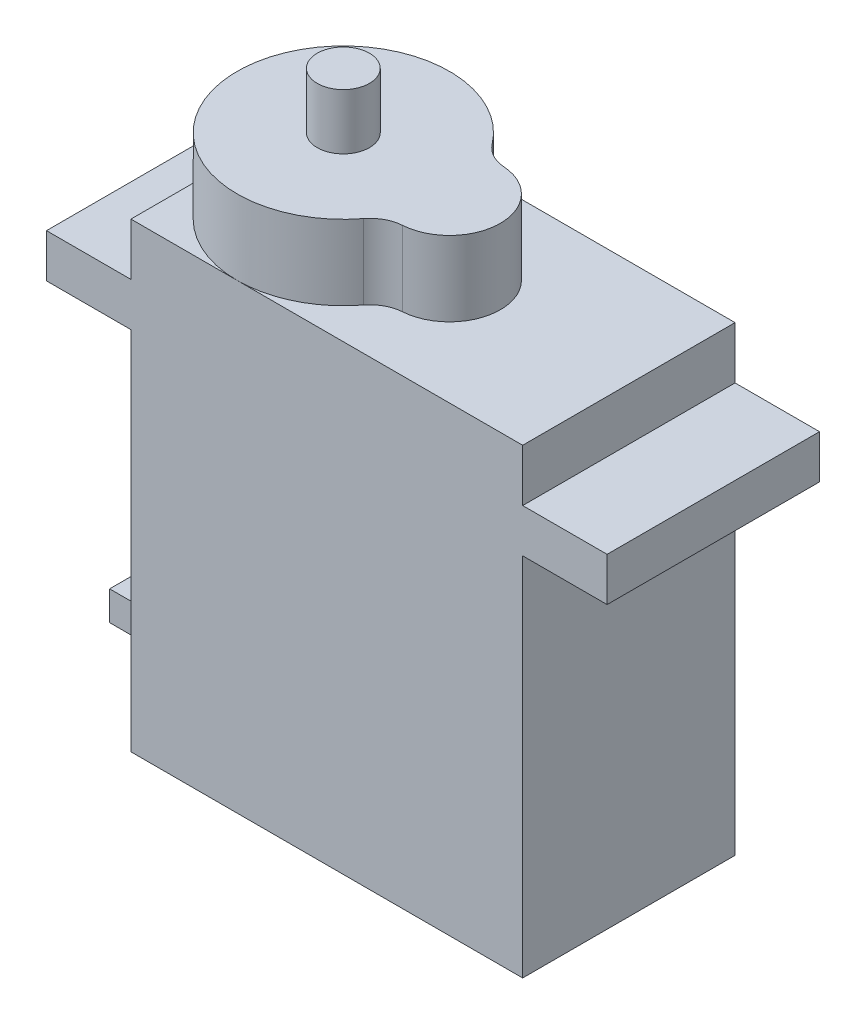
ISO-10303-21;
HEADER;
FILE_DESCRIPTION(('STEP AP214'),'2;1');
FILE_NAME('part.step','',(''),(''),'','','');
FILE_SCHEMA(('AUTOMOTIVE_DESIGN { 1 0 10303 214 1 1 1 1 }'));
ENDSEC;
DATA;
#1=APPLICATION_CONTEXT('core data for automotive mechanical design processes');
#2=APPLICATION_PROTOCOL_DEFINITION('international standard','automotive_design',2000,#1);
#3=PRODUCT_CONTEXT('',#1,'mechanical');
#4=PRODUCT('Part','Part','',(#3));
#5=PRODUCT_RELATED_PRODUCT_CATEGORY('part','',(#4));
#6=PRODUCT_DEFINITION_FORMATION('','',#4);
#7=PRODUCT_DEFINITION_CONTEXT('part definition',#1,'design');
#8=PRODUCT_DEFINITION('design','',#6,#7);
#9=PRODUCT_DEFINITION_SHAPE('','',#8);
#10=(LENGTH_UNIT() NAMED_UNIT(*) SI_UNIT(.MILLI.,.METRE.));
#11=(NAMED_UNIT(*) PLANE_ANGLE_UNIT() SI_UNIT($,.RADIAN.));
#12=(NAMED_UNIT(*) SI_UNIT($,.STERADIAN.) SOLID_ANGLE_UNIT());
#13=UNCERTAINTY_MEASURE_WITH_UNIT(LENGTH_MEASURE(1.E-05),#10,'distance_accuracy_value','');
#14=(GEOMETRIC_REPRESENTATION_CONTEXT(3) GLOBAL_UNCERTAINTY_ASSIGNED_CONTEXT((#13)) GLOBAL_UNIT_ASSIGNED_CONTEXT((#10,
#11,#12)) REPRESENTATION_CONTEXT('',''));
#15=CARTESIAN_POINT('',(0.,0.,0.));
#16=DIRECTION('',(0.,0.,1.));
#17=DIRECTION('',(1.,0.,0.));
#18=AXIS2_PLACEMENT_3D('',#15,#16,#17);
#19=CARTESIAN_POINT('',(-11.25,0.,12.2));
#20=DIRECTION('',(1.,0.,0.));
#21=DIRECTION('',(0.,0.,-1.));
#22=AXIS2_PLACEMENT_3D('',#19,#20,#21);
#23=PLANE('',#22);
#24=DIRECTION('',(0.,-1.,0.));
#25=VECTOR('',#24,1.);
#26=CARTESIAN_POINT('',(-11.25,0.,0.));
#27=LINE('',#26,#25);
#28=CARTESIAN_POINT('',(-11.25,21.,0.));
#29=VERTEX_POINT('',#28);
#30=CARTESIAN_POINT('',(-11.25,0.,0.));
#31=VERTEX_POINT('',#30);
#32=EDGE_CURVE('E302',#29,#31,#27,.T.);
#33=ORIENTED_EDGE('',*,*,#32,.T.);
#34=DIRECTION('',(0.,0.,-1.));
#35=VECTOR('',#34,1.);
#36=CARTESIAN_POINT('',(-11.25,0.,12.2));
#37=LINE('',#36,#35);
#38=CARTESIAN_POINT('',(-11.25,0.,12.2));
#39=VERTEX_POINT('',#38);
#40=EDGE_CURVE('E307',#39,#31,#37,.T.);
#41=ORIENTED_EDGE('',*,*,#40,.F.);
#42=DIRECTION('',(0.,-1.,0.));
#43=VECTOR('',#42,1.);
#44=CARTESIAN_POINT('',(-11.25,0.,12.2));
#45=LINE('',#44,#43);
#46=CARTESIAN_POINT('',(-11.25,21.,12.2));
#47=VERTEX_POINT('',#46);
#48=EDGE_CURVE('E275',#47,#39,#45,.T.);
#49=ORIENTED_EDGE('',*,*,#48,.F.);
#50=DIRECTION('',(0.,0.,-1.));
#51=VECTOR('',#50,1.);
#52=CARTESIAN_POINT('',(-11.25,21.,12.2));
#53=LINE('',#52,#51);
#54=EDGE_CURVE('E310',#47,#29,#53,.T.);
#55=ORIENTED_EDGE('',*,*,#54,.T.);
#56=EDGE_LOOP('',(#33,#41,#49,#55));
#57=FACE_BOUND('',#56,.T.);
#58=DIRECTION('',(0.,1.,0.));
#59=VECTOR('',#58,1.);
#60=CARTESIAN_POINT('',(-11.25,2.03655554591364,8.42287388678305));
#61=LINE('',#60,#59);
#62=CARTESIAN_POINT('',(-11.25,2.03655554591364,8.42287388678305));
#63=VERTEX_POINT('',#62);
#64=CARTESIAN_POINT('',(-11.25,3.71903943259999,8.42287388678305));
#65=VERTEX_POINT('',#64);
#66=EDGE_CURVE('E207',#63,#65,#61,.T.);
#67=ORIENTED_EDGE('',*,*,#66,.F.);
#68=DIRECTION('',(0.,0.,1.));
#69=VECTOR('',#68,1.);
#70=CARTESIAN_POINT('',(-11.25,2.03655554591364,3.77712611321695));
#71=LINE('',#70,#69);
#72=CARTESIAN_POINT('',(-11.25,2.03655554591364,3.77712611321695));
#73=VERTEX_POINT('',#72);
#74=EDGE_CURVE('E204',#73,#63,#71,.T.);
#75=ORIENTED_EDGE('',*,*,#74,.F.);
#76=DIRECTION('',(0.,-1.,0.));
#77=VECTOR('',#76,1.);
#78=CARTESIAN_POINT('',(-11.25,2.03655554591364,3.77712611321695));
#79=LINE('',#78,#77);
#80=CARTESIAN_POINT('',(-11.25,3.71903943259999,3.77712611321695));
#81=VERTEX_POINT('',#80);
#82=EDGE_CURVE('E61',#81,#73,#79,.T.);
#83=ORIENTED_EDGE('',*,*,#82,.F.);
#84=DIRECTION('',(0.,0.,-1.));
#85=VECTOR('',#84,1.);
#86=CARTESIAN_POINT('',(-11.25,3.71903943259999,3.77712611321695));
#87=LINE('',#86,#85);
#88=EDGE_CURVE('E56',#65,#81,#87,.T.);
#89=ORIENTED_EDGE('',*,*,#88,.F.);
#90=EDGE_LOOP('',(#67,#75,#83,#89));
#91=FACE_BOUND('',#90,.T.);
#92=ADVANCED_FACE('F38',(#57,#91),#23,.F.);
#93=CARTESIAN_POINT('',(11.25,26.5,12.2));
#94=DIRECTION('',(0.,-1.,0.));
#95=DIRECTION('',(0.,0.,-1.));
#96=AXIS2_PLACEMENT_3D('',#93,#94,#95);
#97=PLANE('',#96);
#98=CARTESIAN_POINT('',(-5.15,26.5,6.1));
#99=DIRECTION('',(0.,1.,0.));
#100=DIRECTION('',(0.,0.,1.));
#101=AXIS2_PLACEMENT_3D('',#98,#99,#100);
#102=CIRCLE('',#101,6.1);
#103=CARTESIAN_POINT('',(-0.298176494875664,26.5,2.40272956424297));
#104=VERTEX_POINT('',#103);
#105=CARTESIAN_POINT('',(-5.15,26.5,0.));
#106=VERTEX_POINT('',#105);
#107=EDGE_CURVE('E49',#104,#106,#102,.T.);
#108=ORIENTED_EDGE('',*,*,#107,.F.);
#109=CARTESIAN_POINT('',(1.29258531008314,26.5,1.19050974924067));
#110=DIRECTION('',(0.,1.,0.));
#111=DIRECTION('',(0.,0.,1.));
#112=AXIS2_PLACEMENT_3D('',#109,#110,#111);
#113=CIRCLE('',#112,2.);
#114=CARTESIAN_POINT('',(1.15336341348326,26.5,3.1856581806881));
#115=VERTEX_POINT('',#114);
#116=EDGE_CURVE('E218',#104,#115,#113,.T.);
#117=ORIENTED_EDGE('',*,*,#116,.T.);
#118=CARTESIAN_POINT('',(0.949999999999996,26.5,6.1));
#119=DIRECTION('',(0.,1.,0.));
#120=DIRECTION('',(0.,0.,1.));
#121=AXIS2_PLACEMENT_3D('',#118,#119,#120);
#122=CIRCLE('',#121,2.92142857481298);
#123=CARTESIAN_POINT('',(1.15336341348326,26.5,9.0143418193119));
#124=VERTEX_POINT('',#123);
#125=EDGE_CURVE('E231',#124,#115,#122,.T.);
#126=ORIENTED_EDGE('',*,*,#125,.F.);
#127=CARTESIAN_POINT('',(1.29258531008314,26.5,11.0094902507593));
#128=DIRECTION('',(0.,-1.,0.));
#129=DIRECTION('',(0.,0.,-1.));
#130=AXIS2_PLACEMENT_3D('',#127,#128,#129);
#131=CIRCLE('',#130,2.);
#132=CARTESIAN_POINT('',(-0.298176494875664,26.5,9.79727043575703));
#133=VERTEX_POINT('',#132);
#134=EDGE_CURVE('E234',#133,#124,#131,.T.);
#135=ORIENTED_EDGE('',*,*,#134,.F.);
#136=CARTESIAN_POINT('',(-5.15,26.5,12.2));
#137=VERTEX_POINT('',#136);
#138=EDGE_CURVE('E238',#137,#133,#102,.T.);
#139=ORIENTED_EDGE('',*,*,#138,.F.);
#140=DIRECTION('',(-1.,0.,0.));
#141=VECTOR('',#140,1.);
#142=CARTESIAN_POINT('',(11.25,26.5,12.2));
#143=LINE('',#142,#141);
#144=CARTESIAN_POINT('',(11.25,26.5,12.2));
#145=VERTEX_POINT('',#144);
#146=EDGE_CURVE('E264',#145,#137,#143,.T.);
#147=ORIENTED_EDGE('',*,*,#146,.F.);
#148=DIRECTION('',(0.,0.,-1.));
#149=VECTOR('',#148,1.);
#150=CARTESIAN_POINT('',(11.25,26.5,12.2));
#151=LINE('',#150,#149);
#152=CARTESIAN_POINT('',(11.25,26.5,0.));
#153=VERTEX_POINT('',#152);
#154=EDGE_CURVE('E326',#145,#153,#151,.T.);
#155=ORIENTED_EDGE('',*,*,#154,.T.);
#156=DIRECTION('',(-1.,0.,0.));
#157=VECTOR('',#156,1.);
#158=CARTESIAN_POINT('',(11.25,26.5,0.));
#159=LINE('',#158,#157);
#160=EDGE_CURVE('E291',#153,#106,#159,.T.);
#161=ORIENTED_EDGE('',*,*,#160,.T.);
#162=EDGE_LOOP('',(#108,#117,#126,#135,#139,#147,#155,#161));
#163=FACE_BOUND('',#162,.T.);
#164=ADVANCED_FACE('F370',(#163),#97,.F.);
#165=CARTESIAN_POINT('',(-11.25,26.5,6.1));
#166=VERTEX_POINT('',#165);
#167=EDGE_CURVE('E11',#106,#166,#102,.T.);
#168=ORIENTED_EDGE('',*,*,#167,.F.);
#169=CARTESIAN_POINT('',(-11.25,26.5,0.));
#170=VERTEX_POINT('',#169);
#171=EDGE_CURVE('E290',#106,#170,#159,.T.);
#172=ORIENTED_EDGE('',*,*,#171,.T.);
#173=DIRECTION('',(0.,0.,-1.));
#174=VECTOR('',#173,1.);
#175=CARTESIAN_POINT('',(-11.25,26.5,12.2));
#176=LINE('',#175,#174);
#177=EDGE_CURVE('E322',#166,#170,#176,.T.);
#178=ORIENTED_EDGE('',*,*,#177,.F.);
#179=EDGE_LOOP('',(#168,#172,#178));
#180=FACE_BOUND('',#179,.T.);
#181=ADVANCED_FACE('F356',(#180),#97,.F.);
#182=CARTESIAN_POINT('',(11.25,0.,12.2));
#183=DIRECTION('',(-1.,0.,0.));
#184=DIRECTION('',(0.,0.,1.));
#185=AXIS2_PLACEMENT_3D('',#182,#183,#184);
#186=PLANE('',#185);
#187=DIRECTION('',(0.,1.,0.));
#188=VECTOR('',#187,1.);
#189=CARTESIAN_POINT('',(11.25,0.,0.));
#190=LINE('',#189,#188);
#191=CARTESIAN_POINT('',(11.25,0.,0.));
#192=VERTEX_POINT('',#191);
#193=CARTESIAN_POINT('',(11.25,21.,0.));
#194=VERTEX_POINT('',#193);
#195=EDGE_CURVE('E242',#192,#194,#190,.T.);
#196=ORIENTED_EDGE('',*,*,#195,.T.);
#197=DIRECTION('',(0.,0.,-1.));
#198=VECTOR('',#197,1.);
#199=CARTESIAN_POINT('',(11.25,21.,12.2));
#200=LINE('',#199,#198);
#201=CARTESIAN_POINT('',(11.25,21.,12.2));
#202=VERTEX_POINT('',#201);
#203=EDGE_CURVE('E42',#202,#194,#200,.T.);
#204=ORIENTED_EDGE('',*,*,#203,.F.);
#205=DIRECTION('',(0.,1.,0.));
#206=VECTOR('',#205,1.);
#207=CARTESIAN_POINT('',(11.25,0.,12.2));
#208=LINE('',#207,#206);
#209=CARTESIAN_POINT('',(11.25,0.,12.2));
#210=VERTEX_POINT('',#209);
#211=EDGE_CURVE('E251',#210,#202,#208,.T.);
#212=ORIENTED_EDGE('',*,*,#211,.F.);
#213=DIRECTION('',(0.,0.,-1.));
#214=VECTOR('',#213,1.);
#215=CARTESIAN_POINT('',(11.25,0.,12.2));
#216=LINE('',#215,#214);
#217=EDGE_CURVE('E279',#210,#192,#216,.T.);
#218=ORIENTED_EDGE('',*,*,#217,.T.);
#219=EDGE_LOOP('',(#196,#204,#212,#218));
#220=FACE_BOUND('',#219,.T.);
#221=ADVANCED_FACE('F40',(#220),#186,.F.);
#222=CARTESIAN_POINT('',(11.25,21.,12.2));
#223=DIRECTION('',(0.,1.,0.));
#224=DIRECTION('',(-1.,0.,0.));
#225=AXIS2_PLACEMENT_3D('',#222,#223,#224);
#226=PLANE('',#225);
#227=DIRECTION('',(1.,0.,0.));
#228=VECTOR('',#227,1.);
#229=CARTESIAN_POINT('',(11.25,21.,0.));
#230=LINE('',#229,#228);
#231=CARTESIAN_POINT('',(16.1,21.,0.));
#232=VERTEX_POINT('',#231);
#233=EDGE_CURVE('E282',#194,#232,#230,.T.);
#234=ORIENTED_EDGE('',*,*,#233,.T.);
#235=DIRECTION('',(0.,0.,-1.));
#236=VECTOR('',#235,1.);
#237=CARTESIAN_POINT('',(16.1,21.,12.2));
#238=LINE('',#237,#236);
#239=CARTESIAN_POINT('',(16.1,21.,12.2));
#240=VERTEX_POINT('',#239);
#241=EDGE_CURVE('E334',#240,#232,#238,.T.);
#242=ORIENTED_EDGE('',*,*,#241,.F.);
#243=DIRECTION('',(1.,0.,0.));
#244=VECTOR('',#243,1.);
#245=CARTESIAN_POINT('',(11.25,21.,12.2));
#246=LINE('',#245,#244);
#247=EDGE_CURVE('E254',#202,#240,#246,.T.);
#248=ORIENTED_EDGE('',*,*,#247,.F.);
#249=ORIENTED_EDGE('',*,*,#203,.T.);
#250=EDGE_LOOP('',(#234,#242,#248,#249));
#251=FACE_BOUND('',#250,.T.);
#252=ADVANCED_FACE('F416',(#251),#226,.F.);
#253=CARTESIAN_POINT('',(16.1,21.,12.2));
#254=DIRECTION('',(-1.,0.,0.));
#255=DIRECTION('',(0.,0.,1.));
#256=AXIS2_PLACEMENT_3D('',#253,#254,#255);
#257=PLANE('',#256);
#258=DIRECTION('',(0.,1.,0.));
#259=VECTOR('',#258,1.);
#260=CARTESIAN_POINT('',(16.1,21.,0.));
#261=LINE('',#260,#259);
#262=CARTESIAN_POINT('',(16.1,23.5,0.));
#263=VERTEX_POINT('',#262);
#264=EDGE_CURVE('E284',#232,#263,#261,.T.);
#265=ORIENTED_EDGE('',*,*,#264,.T.);
#266=DIRECTION('',(0.,0.,-1.));
#267=VECTOR('',#266,1.);
#268=CARTESIAN_POINT('',(16.1,23.5,12.2));
#269=LINE('',#268,#267);
#270=CARTESIAN_POINT('',(16.1,23.5,12.2));
#271=VERTEX_POINT('',#270);
#272=EDGE_CURVE('E332',#271,#263,#269,.T.);
#273=ORIENTED_EDGE('',*,*,#272,.F.);
#274=DIRECTION('',(0.,1.,0.));
#275=VECTOR('',#274,1.);
#276=CARTESIAN_POINT('',(16.1,21.,12.2));
#277=LINE('',#276,#275);
#278=EDGE_CURVE('E257',#240,#271,#277,.T.);
#279=ORIENTED_EDGE('',*,*,#278,.F.);
#280=ORIENTED_EDGE('',*,*,#241,.T.);
#281=EDGE_LOOP('',(#265,#273,#279,#280));
#282=FACE_BOUND('',#281,.T.);
#283=ADVANCED_FACE('F418',(#282),#257,.F.);
#284=CARTESIAN_POINT('',(16.1,23.5,12.2));
#285=DIRECTION('',(0.,-1.,0.));
#286=DIRECTION('',(0.,0.,-1.));
#287=AXIS2_PLACEMENT_3D('',#284,#285,#286);
#288=PLANE('',#287);
#289=DIRECTION('',(-1.,0.,0.));
#290=VECTOR('',#289,1.);
#291=CARTESIAN_POINT('',(16.1,23.5,0.));
#292=LINE('',#291,#290);
#293=CARTESIAN_POINT('',(11.25,23.5,0.));
#294=VERTEX_POINT('',#293);
#295=EDGE_CURVE('E286',#263,#294,#292,.T.);
#296=ORIENTED_EDGE('',*,*,#295,.T.);
#297=DIRECTION('',(0.,0.,-1.));
#298=VECTOR('',#297,1.);
#299=CARTESIAN_POINT('',(11.25,23.5,12.2));
#300=LINE('',#299,#298);
#301=CARTESIAN_POINT('',(11.25,23.5,12.2));
#302=VERTEX_POINT('',#301);
#303=EDGE_CURVE('E329',#302,#294,#300,.T.);
#304=ORIENTED_EDGE('',*,*,#303,.F.);
#305=DIRECTION('',(-1.,0.,0.));
#306=VECTOR('',#305,1.);
#307=CARTESIAN_POINT('',(16.1,23.5,12.2));
#308=LINE('',#307,#306);
#309=EDGE_CURVE('E259',#271,#302,#308,.T.);
#310=ORIENTED_EDGE('',*,*,#309,.F.);
#311=ORIENTED_EDGE('',*,*,#272,.T.);
#312=EDGE_LOOP('',(#296,#304,#310,#311));
#313=FACE_BOUND('',#312,.T.);
#314=ADVANCED_FACE('F422',(#313),#288,.F.);
#315=CARTESIAN_POINT('',(11.25,23.5,12.2));
#316=DIRECTION('',(-1.,0.,0.));
#317=DIRECTION('',(0.,-1.,0.));
#318=AXIS2_PLACEMENT_3D('',#315,#316,#317);
#319=PLANE('',#318);
#320=DIRECTION('',(0.,1.,0.));
#321=VECTOR('',#320,1.);
#322=CARTESIAN_POINT('',(11.25,23.5,0.));
#323=LINE('',#322,#321);
#324=EDGE_CURVE('E288',#294,#153,#323,.T.);
#325=ORIENTED_EDGE('',*,*,#324,.T.);
#326=ORIENTED_EDGE('',*,*,#154,.F.);
#327=DIRECTION('',(0.,1.,0.));
#328=VECTOR('',#327,1.);
#329=CARTESIAN_POINT('',(11.25,23.5,12.2));
#330=LINE('',#329,#328);
#331=EDGE_CURVE('E261',#302,#145,#330,.T.);
#332=ORIENTED_EDGE('',*,*,#331,.F.);
#333=ORIENTED_EDGE('',*,*,#303,.T.);
#334=EDGE_LOOP('',(#325,#326,#332,#333));
#335=FACE_BOUND('',#334,.T.);
#336=ADVANCED_FACE('F424',(#335),#319,.F.);
#337=EDGE_CURVE('E47',#166,#137,#102,.T.);
#338=ORIENTED_EDGE('',*,*,#337,.F.);
#339=CARTESIAN_POINT('',(-11.25,26.5,12.2));
#340=VERTEX_POINT('',#339);
#341=EDGE_CURVE('E323',#340,#166,#176,.T.);
#342=ORIENTED_EDGE('',*,*,#341,.F.);
#343=EDGE_CURVE('E263',#137,#340,#143,.T.);
#344=ORIENTED_EDGE('',*,*,#343,.F.);
#345=EDGE_LOOP('',(#338,#342,#344));
#346=FACE_BOUND('',#345,.T.);
#347=ADVANCED_FACE('F352',(#346),#97,.F.);
#348=CARTESIAN_POINT('',(-11.25,23.5,12.2));
#349=DIRECTION('',(1.,0.,0.));
#350=DIRECTION('',(0.,1.,0.));
#351=AXIS2_PLACEMENT_3D('',#348,#349,#350);
#352=PLANE('',#351);
#353=DIRECTION('',(0.,-1.,0.));
#354=VECTOR('',#353,1.);
#355=CARTESIAN_POINT('',(-11.25,23.5,0.));
#356=LINE('',#355,#354);
#357=CARTESIAN_POINT('',(-11.25,23.5,0.));
#358=VERTEX_POINT('',#357);
#359=EDGE_CURVE('E294',#170,#358,#356,.T.);
#360=ORIENTED_EDGE('',*,*,#359,.T.);
#361=DIRECTION('',(0.,0.,-1.));
#362=VECTOR('',#361,1.);
#363=CARTESIAN_POINT('',(-11.25,23.5,12.2));
#364=LINE('',#363,#362);
#365=CARTESIAN_POINT('',(-11.25,23.5,12.2));
#366=VERTEX_POINT('',#365);
#367=EDGE_CURVE('E319',#366,#358,#364,.T.);
#368=ORIENTED_EDGE('',*,*,#367,.F.);
#369=DIRECTION('',(0.,-1.,0.));
#370=VECTOR('',#369,1.);
#371=CARTESIAN_POINT('',(-11.25,23.5,12.2));
#372=LINE('',#371,#370);
#373=EDGE_CURVE('E267',#340,#366,#372,.T.);
#374=ORIENTED_EDGE('',*,*,#373,.F.);
#375=ORIENTED_EDGE('',*,*,#341,.T.);
#376=ORIENTED_EDGE('',*,*,#177,.T.);
#377=EDGE_LOOP('',(#360,#368,#374,#375,#376));
#378=FACE_BOUND('',#377,.T.);
#379=ADVANCED_FACE('F360',(#378),#352,.F.);
#380=CARTESIAN_POINT('',(-16.1,23.5,12.2));
#381=DIRECTION('',(0.,-1.,0.));
#382=DIRECTION('',(0.,0.,-1.));
#383=AXIS2_PLACEMENT_3D('',#380,#381,#382);
#384=PLANE('',#383);
#385=DIRECTION('',(-1.,0.,0.));
#386=VECTOR('',#385,1.);
#387=CARTESIAN_POINT('',(-16.1,23.5,0.));
#388=LINE('',#387,#386);
#389=CARTESIAN_POINT('',(-16.1,23.5,0.));
#390=VERTEX_POINT('',#389);
#391=EDGE_CURVE('E296',#358,#390,#388,.T.);
#392=ORIENTED_EDGE('',*,*,#391,.T.);
#393=DIRECTION('',(0.,0.,-1.));
#394=VECTOR('',#393,1.);
#395=CARTESIAN_POINT('',(-16.1,23.5,12.2));
#396=LINE('',#395,#394);
#397=CARTESIAN_POINT('',(-16.1,23.5,12.2));
#398=VERTEX_POINT('',#397);
#399=EDGE_CURVE('E316',#398,#390,#396,.T.);
#400=ORIENTED_EDGE('',*,*,#399,.F.);
#401=DIRECTION('',(-1.,0.,0.));
#402=VECTOR('',#401,1.);
#403=CARTESIAN_POINT('',(-16.1,23.5,12.2));
#404=LINE('',#403,#402);
#405=EDGE_CURVE('E269',#366,#398,#404,.T.);
#406=ORIENTED_EDGE('',*,*,#405,.F.);
#407=ORIENTED_EDGE('',*,*,#367,.T.);
#408=EDGE_LOOP('',(#392,#400,#406,#407));
#409=FACE_BOUND('',#408,.T.);
#410=ADVANCED_FACE('F395',(#409),#384,.F.);
#411=CARTESIAN_POINT('',(-16.1,21.,12.2));
#412=DIRECTION('',(1.,0.,0.));
#413=DIRECTION('',(0.,0.,-1.));
#414=AXIS2_PLACEMENT_3D('',#411,#412,#413);
#415=PLANE('',#414);
#416=DIRECTION('',(0.,-1.,0.));
#417=VECTOR('',#416,1.);
#418=CARTESIAN_POINT('',(-16.1,21.,0.));
#419=LINE('',#418,#417);
#420=CARTESIAN_POINT('',(-16.1,21.,0.));
#421=VERTEX_POINT('',#420);
#422=EDGE_CURVE('E298',#390,#421,#419,.T.);
#423=ORIENTED_EDGE('',*,*,#422,.T.);
#424=DIRECTION('',(0.,0.,-1.));
#425=VECTOR('',#424,1.);
#426=CARTESIAN_POINT('',(-16.1,21.,12.2));
#427=LINE('',#426,#425);
#428=CARTESIAN_POINT('',(-16.1,21.,12.2));
#429=VERTEX_POINT('',#428);
#430=EDGE_CURVE('E313',#429,#421,#427,.T.);
#431=ORIENTED_EDGE('',*,*,#430,.F.);
#432=DIRECTION('',(0.,-1.,0.));
#433=VECTOR('',#432,1.);
#434=CARTESIAN_POINT('',(-16.1,21.,12.2));
#435=LINE('',#434,#433);
#436=EDGE_CURVE('E271',#398,#429,#435,.T.);
#437=ORIENTED_EDGE('',*,*,#436,.F.);
#438=ORIENTED_EDGE('',*,*,#399,.T.);
#439=EDGE_LOOP('',(#423,#431,#437,#438));
#440=FACE_BOUND('',#439,.T.);
#441=ADVANCED_FACE('F399',(#440),#415,.F.);
#442=CARTESIAN_POINT('',(-11.25,21.,12.2));
#443=DIRECTION('',(0.,1.,0.));
#444=DIRECTION('',(0.,0.,1.));
#445=AXIS2_PLACEMENT_3D('',#442,#443,#444);
#446=PLANE('',#445);
#447=DIRECTION('',(1.,0.,0.));
#448=VECTOR('',#447,1.);
#449=CARTESIAN_POINT('',(-11.25,21.,0.));
#450=LINE('',#449,#448);
#451=EDGE_CURVE('E300',#421,#29,#450,.T.);
#452=ORIENTED_EDGE('',*,*,#451,.T.);
#453=ORIENTED_EDGE('',*,*,#54,.F.);
#454=DIRECTION('',(1.,0.,0.));
#455=VECTOR('',#454,1.);
#456=CARTESIAN_POINT('',(-11.25,21.,12.2));
#457=LINE('',#456,#455);
#458=EDGE_CURVE('E273',#429,#47,#457,.T.);
#459=ORIENTED_EDGE('',*,*,#458,.F.);
#460=ORIENTED_EDGE('',*,*,#430,.T.);
#461=EDGE_LOOP('',(#452,#453,#459,#460));
#462=FACE_BOUND('',#461,.T.);
#463=ADVANCED_FACE('F405',(#462),#446,.F.);
#464=CARTESIAN_POINT('',(-11.25,0.,12.2));
#465=DIRECTION('',(0.,1.,0.));
#466=DIRECTION('',(0.,0.,1.));
#467=AXIS2_PLACEMENT_3D('',#464,#465,#466);
#468=PLANE('',#467);
#469=DIRECTION('',(1.,0.,0.));
#470=VECTOR('',#469,1.);
#471=CARTESIAN_POINT('',(-11.25,0.,0.));
#472=LINE('',#471,#470);
#473=EDGE_CURVE('E255',#31,#192,#472,.T.);
#474=ORIENTED_EDGE('',*,*,#473,.T.);
#475=ORIENTED_EDGE('',*,*,#217,.F.);
#476=DIRECTION('',(1.,0.,0.));
#477=VECTOR('',#476,1.);
#478=CARTESIAN_POINT('',(-11.25,0.,12.2));
#479=LINE('',#478,#477);
#480=EDGE_CURVE('E277',#39,#210,#479,.T.);
#481=ORIENTED_EDGE('',*,*,#480,.F.);
#482=ORIENTED_EDGE('',*,*,#40,.T.);
#483=EDGE_LOOP('',(#474,#475,#481,#482));
#484=FACE_BOUND('',#483,.T.);
#485=ADVANCED_FACE('F413',(#484),#468,.F.);
#486=CARTESIAN_POINT('',(0.,0.,12.2));
#487=DIRECTION('',(0.,0.,-1.));
#488=DIRECTION('',(-1.,0.,0.));
#489=AXIS2_PLACEMENT_3D('',#486,#487,#488);
#490=PLANE('',#489);
#491=ORIENTED_EDGE('',*,*,#211,.T.);
#492=ORIENTED_EDGE('',*,*,#247,.T.);
#493=ORIENTED_EDGE('',*,*,#278,.T.);
#494=ORIENTED_EDGE('',*,*,#309,.T.);
#495=ORIENTED_EDGE('',*,*,#331,.T.);
#496=ORIENTED_EDGE('',*,*,#146,.T.);
#497=ORIENTED_EDGE('',*,*,#343,.T.);
#498=ORIENTED_EDGE('',*,*,#373,.T.);
#499=ORIENTED_EDGE('',*,*,#405,.T.);
#500=ORIENTED_EDGE('',*,*,#436,.T.);
#501=ORIENTED_EDGE('',*,*,#458,.T.);
#502=ORIENTED_EDGE('',*,*,#48,.T.);
#503=ORIENTED_EDGE('',*,*,#480,.T.);
#504=EDGE_LOOP('',(#491,#492,#493,#494,#495,#496,#497,#498,#499,#500,#501,#502,#503));
#505=FACE_BOUND('',#504,.T.);
#506=ADVANCED_FACE('F364',(#505),#490,.F.);
#507=CARTESIAN_POINT('',(0.,0.,0.));
#508=DIRECTION('',(0.,0.,-1.));
#509=DIRECTION('',(-1.,0.,0.));
#510=AXIS2_PLACEMENT_3D('',#507,#508,#509);
#511=PLANE('',#510);
#512=ORIENTED_EDGE('',*,*,#195,.F.);
#513=ORIENTED_EDGE('',*,*,#473,.F.);
#514=ORIENTED_EDGE('',*,*,#32,.F.);
#515=ORIENTED_EDGE('',*,*,#451,.F.);
#516=ORIENTED_EDGE('',*,*,#422,.F.);
#517=ORIENTED_EDGE('',*,*,#391,.F.);
#518=ORIENTED_EDGE('',*,*,#359,.F.);
#519=ORIENTED_EDGE('',*,*,#171,.F.);
#520=ORIENTED_EDGE('',*,*,#160,.F.);
#521=ORIENTED_EDGE('',*,*,#324,.F.);
#522=ORIENTED_EDGE('',*,*,#295,.F.);
#523=ORIENTED_EDGE('',*,*,#264,.F.);
#524=ORIENTED_EDGE('',*,*,#233,.F.);
#525=EDGE_LOOP('',(#512,#513,#514,#515,#516,#517,#518,#519,#520,#521,#522,#523,#524));
#526=FACE_BOUND('',#525,.T.);
#527=ADVANCED_FACE('F390',(#526),#511,.T.);
#528=CARTESIAN_POINT('',(1.29258531008314,30.8,1.19050974924067));
#529=DIRECTION('',(0.,-1.,0.));
#530=DIRECTION('',(0.,0.,-1.));
#531=AXIS2_PLACEMENT_3D('',#528,#529,#530);
#532=CYLINDRICAL_SURFACE('',#531,2.);
#533=ORIENTED_EDGE('',*,*,#116,.F.);
#534=DIRECTION('',(0.,-1.,0.));
#535=VECTOR('',#534,1.);
#536=CARTESIAN_POINT('',(-0.298176494875664,30.8,2.40272956424297));
#537=LINE('',#536,#535);
#538=CARTESIAN_POINT('',(-0.298176494875664,30.8,2.40272956424297));
#539=VERTEX_POINT('',#538);
#540=EDGE_CURVE('E239',#539,#104,#537,.T.);
#541=ORIENTED_EDGE('',*,*,#540,.F.);
#542=CARTESIAN_POINT('',(1.29258531008314,30.8,1.19050974924067));
#543=DIRECTION('',(0.,1.,0.));
#544=DIRECTION('',(0.,0.,1.));
#545=AXIS2_PLACEMENT_3D('',#542,#543,#544);
#546=CIRCLE('',#545,2.);
#547=CARTESIAN_POINT('',(1.15336341348326,30.8,3.1856581806881));
#548=VERTEX_POINT('',#547);
#549=EDGE_CURVE('E220',#539,#548,#546,.T.);
#550=ORIENTED_EDGE('',*,*,#549,.T.);
#551=DIRECTION('',(0.,-1.,0.));
#552=VECTOR('',#551,1.);
#553=CARTESIAN_POINT('',(1.15336341348326,30.8,3.1856581806881));
#554=LINE('',#553,#552);
#555=EDGE_CURVE('E229',#548,#115,#554,.T.);
#556=ORIENTED_EDGE('',*,*,#555,.T.);
#557=EDGE_LOOP('',(#533,#541,#550,#556));
#558=FACE_BOUND('',#557,.T.);
#559=ADVANCED_FACE('F386',(#558),#532,.F.);
#560=CARTESIAN_POINT('',(-5.15,30.8,6.1));
#561=DIRECTION('',(0.,-1.,0.));
#562=DIRECTION('',(0.,0.,-1.));
#563=AXIS2_PLACEMENT_3D('',#560,#561,#562);
#564=CYLINDRICAL_SURFACE('',#563,6.1);
#565=ORIENTED_EDGE('',*,*,#107,.T.);
#566=ORIENTED_EDGE('',*,*,#167,.T.);
#567=ORIENTED_EDGE('',*,*,#337,.T.);
#568=ORIENTED_EDGE('',*,*,#138,.T.);
#569=DIRECTION('',(0.,-1.,0.));
#570=VECTOR('',#569,1.);
#571=CARTESIAN_POINT('',(-0.298176494875664,30.8,9.79727043575703));
#572=LINE('',#571,#570);
#573=CARTESIAN_POINT('',(-0.298176494875664,30.8,9.79727043575703));
#574=VERTEX_POINT('',#573);
#575=EDGE_CURVE('E243',#574,#133,#572,.T.);
#576=ORIENTED_EDGE('',*,*,#575,.F.);
#577=CARTESIAN_POINT('',(-5.15,30.8,6.1));
#578=DIRECTION('',(0.,1.,0.));
#579=DIRECTION('',(0.,0.,1.));
#580=AXIS2_PLACEMENT_3D('',#577,#578,#579);
#581=CIRCLE('',#580,6.1);
#582=EDGE_CURVE('E227',#539,#574,#581,.T.);
#583=ORIENTED_EDGE('',*,*,#582,.F.);
#584=ORIENTED_EDGE('',*,*,#540,.T.);
#585=EDGE_LOOP('',(#565,#566,#567,#568,#576,#583,#584));
#586=FACE_BOUND('',#585,.T.);
#587=ADVANCED_FACE('F347',(#586),#564,.T.);
#588=CARTESIAN_POINT('',(1.29258531008314,30.8,11.0094902507593));
#589=DIRECTION('',(0.,-1.,0.));
#590=DIRECTION('',(0.,0.,-1.));
#591=AXIS2_PLACEMENT_3D('',#588,#589,#590);
#592=CYLINDRICAL_SURFACE('',#591,2.);
#593=ORIENTED_EDGE('',*,*,#134,.T.);
#594=DIRECTION('',(0.,-1.,0.));
#595=VECTOR('',#594,1.);
#596=CARTESIAN_POINT('',(1.15336341348326,30.8,9.0143418193119));
#597=LINE('',#596,#595);
#598=CARTESIAN_POINT('',(1.15336341348326,30.8,9.0143418193119));
#599=VERTEX_POINT('',#598);
#600=EDGE_CURVE('E246',#599,#124,#597,.T.);
#601=ORIENTED_EDGE('',*,*,#600,.F.);
#602=CARTESIAN_POINT('',(1.29258531008314,30.8,11.0094902507593));
#603=DIRECTION('',(0.,-1.,0.));
#604=DIRECTION('',(0.,0.,-1.));
#605=AXIS2_PLACEMENT_3D('',#602,#603,#604);
#606=CIRCLE('',#605,2.);
#607=EDGE_CURVE('E225',#574,#599,#606,.T.);
#608=ORIENTED_EDGE('',*,*,#607,.F.);
#609=ORIENTED_EDGE('',*,*,#575,.T.);
#610=EDGE_LOOP('',(#593,#601,#608,#609));
#611=FACE_BOUND('',#610,.T.);
#612=ADVANCED_FACE('F374',(#611),#592,.F.);
#613=CARTESIAN_POINT('',(0.949999999999996,30.8,6.1));
#614=DIRECTION('',(0.,-1.,0.));
#615=DIRECTION('',(0.,0.,-1.));
#616=AXIS2_PLACEMENT_3D('',#613,#614,#615);
#617=CYLINDRICAL_SURFACE('',#616,2.92142857481298);
#618=ORIENTED_EDGE('',*,*,#125,.T.);
#619=ORIENTED_EDGE('',*,*,#555,.F.);
#620=CARTESIAN_POINT('',(0.949999999999996,30.8,6.1));
#621=DIRECTION('',(0.,1.,0.));
#622=DIRECTION('',(0.,0.,1.));
#623=AXIS2_PLACEMENT_3D('',#620,#621,#622);
#624=CIRCLE('',#623,2.92142857481298);
#625=EDGE_CURVE('E223',#599,#548,#624,.T.);
#626=ORIENTED_EDGE('',*,*,#625,.F.);
#627=ORIENTED_EDGE('',*,*,#600,.T.);
#628=EDGE_LOOP('',(#618,#619,#626,#627));
#629=FACE_BOUND('',#628,.T.);
#630=ADVANCED_FACE('F378',(#629),#617,.T.);
#631=CARTESIAN_POINT('',(1.12129265504157,30.8,3.64525487462033));
#632=DIRECTION('',(0.,1.,0.));
#633=DIRECTION('',(0.,0.,1.));
#634=AXIS2_PLACEMENT_3D('',#631,#632,#633);
#635=PLANE('',#634);
#636=CARTESIAN_POINT('',(-5.15,30.8,6.1));
#637=DIRECTION('',(0.,1.,0.));
#638=DIRECTION('',(0.,0.,1.));
#639=AXIS2_PLACEMENT_3D('',#636,#637,#638);
#640=CIRCLE('',#639,1.5);
#641=CARTESIAN_POINT('',(-5.15,30.8,7.6));
#642=VERTEX_POINT('',#641);
#643=EDGE_CURVE('E208',#642,#642,#640,.T.);
#644=ORIENTED_EDGE('',*,*,#643,.F.);
#645=EDGE_LOOP('',(#644));
#646=FACE_BOUND('',#645,.T.);
#647=ORIENTED_EDGE('',*,*,#549,.F.);
#648=ORIENTED_EDGE('',*,*,#582,.T.);
#649=ORIENTED_EDGE('',*,*,#607,.T.);
#650=ORIENTED_EDGE('',*,*,#625,.T.);
#651=EDGE_LOOP('',(#647,#648,#649,#650));
#652=FACE_BOUND('',#651,.T.);
#653=ADVANCED_FACE('F382',(#646,#652),#635,.T.);
#654=CARTESIAN_POINT('',(-5.15,34.,6.1));
#655=DIRECTION('',(0.,-1.,0.));
#656=DIRECTION('',(0.,0.,-1.));
#657=AXIS2_PLACEMENT_3D('',#654,#655,#656);
#658=CYLINDRICAL_SURFACE('',#657,1.5);
#659=CARTESIAN_POINT('',(-5.15,34.,6.1));
#660=DIRECTION('',(0.,1.,0.));
#661=DIRECTION('',(0.,0.,1.));
#662=AXIS2_PLACEMENT_3D('',#659,#660,#661);
#663=CIRCLE('',#662,1.5);
#664=CARTESIAN_POINT('',(-5.15,34.,7.6));
#665=VERTEX_POINT('',#664);
#666=EDGE_CURVE('E211',#665,#665,#663,.T.);
#667=ORIENTED_EDGE('',*,*,#666,.F.);
#668=EDGE_LOOP('',(#667));
#669=FACE_BOUND('',#668,.T.);
#670=ORIENTED_EDGE('',*,*,#643,.T.);
#671=EDGE_LOOP('',(#670));
#672=FACE_BOUND('',#671,.T.);
#673=ADVANCED_FACE('F511',(#669,#672),#658,.T.);
#674=CARTESIAN_POINT('',(-5.15,34.,6.1));
#675=DIRECTION('',(0.,1.,0.));
#676=DIRECTION('',(0.,0.,1.));
#677=AXIS2_PLACEMENT_3D('',#674,#675,#676);
#678=PLANE('',#677);
#679=ORIENTED_EDGE('',*,*,#666,.T.);
#680=EDGE_LOOP('',(#679));
#681=FACE_BOUND('',#680,.T.);
#682=ADVANCED_FACE('F519',(#681),#678,.T.);
#683=CARTESIAN_POINT('',(-16.25,2.03655554591364,8.42287388678305));
#684=DIRECTION('',(0.,0.,-1.));
#685=DIRECTION('',(-1.,0.,0.));
#686=AXIS2_PLACEMENT_3D('',#683,#684,#685);
#687=PLANE('',#686);
#688=ORIENTED_EDGE('',*,*,#66,.T.);
#689=DIRECTION('',(1.,0.,0.));
#690=VECTOR('',#689,1.);
#691=CARTESIAN_POINT('',(-16.25,3.71903943259999,8.42287388678305));
#692=LINE('',#691,#690);
#693=CARTESIAN_POINT('',(-16.25,3.71903943259999,8.42287388678305));
#694=VERTEX_POINT('',#693);
#695=EDGE_CURVE('E188',#694,#65,#692,.T.);
#696=ORIENTED_EDGE('',*,*,#695,.F.);
#697=DIRECTION('',(0.,1.,0.));
#698=VECTOR('',#697,1.);
#699=CARTESIAN_POINT('',(-16.25,2.03655554591364,8.42287388678305));
#700=LINE('',#699,#698);
#701=CARTESIAN_POINT('',(-16.25,2.03655554591364,8.42287388678305));
#702=VERTEX_POINT('',#701);
#703=EDGE_CURVE('E195',#702,#694,#700,.T.);
#704=ORIENTED_EDGE('',*,*,#703,.F.);
#705=DIRECTION('',(1.,0.,0.));
#706=VECTOR('',#705,1.);
#707=CARTESIAN_POINT('',(-16.25,2.03655554591364,8.42287388678305));
#708=LINE('',#707,#706);
#709=EDGE_CURVE('E712',#702,#63,#708,.T.);
#710=ORIENTED_EDGE('',*,*,#709,.T.);
#711=EDGE_LOOP('',(#688,#696,#704,#710));
#712=FACE_BOUND('',#711,.T.);
#713=ADVANCED_FACE('F206',(#712),#687,.F.);
#714=CARTESIAN_POINT('',(-16.25,3.71903943259999,3.77712611321695));
#715=DIRECTION('',(0.,-1.,0.));
#716=DIRECTION('',(0.,0.,-1.));
#717=AXIS2_PLACEMENT_3D('',#714,#715,#716);
#718=PLANE('',#717);
#719=ORIENTED_EDGE('',*,*,#88,.T.);
#720=DIRECTION('',(1.,0.,0.));
#721=VECTOR('',#720,1.);
#722=CARTESIAN_POINT('',(-16.25,3.71903943259999,3.77712611321695));
#723=LINE('',#722,#721);
#724=CARTESIAN_POINT('',(-16.25,3.71903943259999,3.77712611321695));
#725=VERTEX_POINT('',#724);
#726=EDGE_CURVE('E191',#725,#81,#723,.T.);
#727=ORIENTED_EDGE('',*,*,#726,.F.);
#728=DIRECTION('',(0.,0.,-1.));
#729=VECTOR('',#728,1.);
#730=CARTESIAN_POINT('',(-16.25,3.71903943259999,3.77712611321695));
#731=LINE('',#730,#729);
#732=EDGE_CURVE('E184',#694,#725,#731,.T.);
#733=ORIENTED_EDGE('',*,*,#732,.F.);
#734=ORIENTED_EDGE('',*,*,#695,.T.);
#735=EDGE_LOOP('',(#719,#727,#733,#734));
#736=FACE_BOUND('',#735,.T.);
#737=ADVANCED_FACE('F186',(#736),#718,.F.);
#738=CARTESIAN_POINT('',(-16.25,2.03655554591364,3.77712611321695));
#739=DIRECTION('',(0.,0.,1.));
#740=DIRECTION('',(1.,0.,0.));
#741=AXIS2_PLACEMENT_3D('',#738,#739,#740);
#742=PLANE('',#741);
#743=ORIENTED_EDGE('',*,*,#82,.T.);
#744=DIRECTION('',(1.,0.,0.));
#745=VECTOR('',#744,1.);
#746=CARTESIAN_POINT('',(-16.25,2.03655554591364,3.77712611321695));
#747=LINE('',#746,#745);
#748=CARTESIAN_POINT('',(-16.25,2.03655554591364,3.77712611321695));
#749=VERTEX_POINT('',#748);
#750=EDGE_CURVE('E213',#749,#73,#747,.T.);
#751=ORIENTED_EDGE('',*,*,#750,.F.);
#752=DIRECTION('',(0.,-1.,0.));
#753=VECTOR('',#752,1.);
#754=CARTESIAN_POINT('',(-16.25,2.03655554591364,3.77712611321695));
#755=LINE('',#754,#753);
#756=EDGE_CURVE('E194',#725,#749,#755,.T.);
#757=ORIENTED_EDGE('',*,*,#756,.F.);
#758=ORIENTED_EDGE('',*,*,#726,.T.);
#759=EDGE_LOOP('',(#743,#751,#757,#758));
#760=FACE_BOUND('',#759,.T.);
#761=ADVANCED_FACE('F540',(#760),#742,.F.);
#762=CARTESIAN_POINT('',(-16.25,2.03655554591364,3.77712611321695));
#763=DIRECTION('',(0.,1.,0.));
#764=DIRECTION('',(0.,0.,1.));
#765=AXIS2_PLACEMENT_3D('',#762,#763,#764);
#766=PLANE('',#765);
#767=ORIENTED_EDGE('',*,*,#74,.T.);
#768=ORIENTED_EDGE('',*,*,#709,.F.);
#769=DIRECTION('',(0.,0.,1.));
#770=VECTOR('',#769,1.);
#771=CARTESIAN_POINT('',(-16.25,2.03655554591364,3.77712611321695));
#772=LINE('',#771,#770);
#773=EDGE_CURVE('E200',#749,#702,#772,.T.);
#774=ORIENTED_EDGE('',*,*,#773,.F.);
#775=ORIENTED_EDGE('',*,*,#750,.T.);
#776=EDGE_LOOP('',(#767,#768,#774,#775));
#777=FACE_BOUND('',#776,.T.);
#778=ADVANCED_FACE('F547',(#777),#766,.F.);
#779=CARTESIAN_POINT('',(-16.25,0.,0.));
#780=DIRECTION('',(1.,0.,0.));
#781=DIRECTION('',(0.,0.,-1.));
#782=AXIS2_PLACEMENT_3D('',#779,#780,#781);
#783=PLANE('',#782);
#784=ORIENTED_EDGE('',*,*,#703,.T.);
#785=ORIENTED_EDGE('',*,*,#732,.T.);
#786=ORIENTED_EDGE('',*,*,#756,.T.);
#787=ORIENTED_EDGE('',*,*,#773,.T.);
#788=EDGE_LOOP('',(#784,#785,#786,#787));
#789=FACE_BOUND('',#788,.T.);
#790=ADVANCED_FACE('F198',(#789),#783,.F.);
#791=CLOSED_SHELL('',(#92,#164,#181,#221,#252,#283,#314,#336,#347,#379,#410,#441,#463,#485,#506,
#527,#559,#587,#612,#630,#653,#673,#682,#713,#737,#761,#778,#790));
#792=MANIFOLD_SOLID_BREP('B2',#791);
#793=ADVANCED_BREP_SHAPE_REPRESENTATION('',(#18,#792),#14);
#794=SHAPE_DEFINITION_REPRESENTATION(#9,#793);
ENDSEC;
END-ISO-10303-21;
